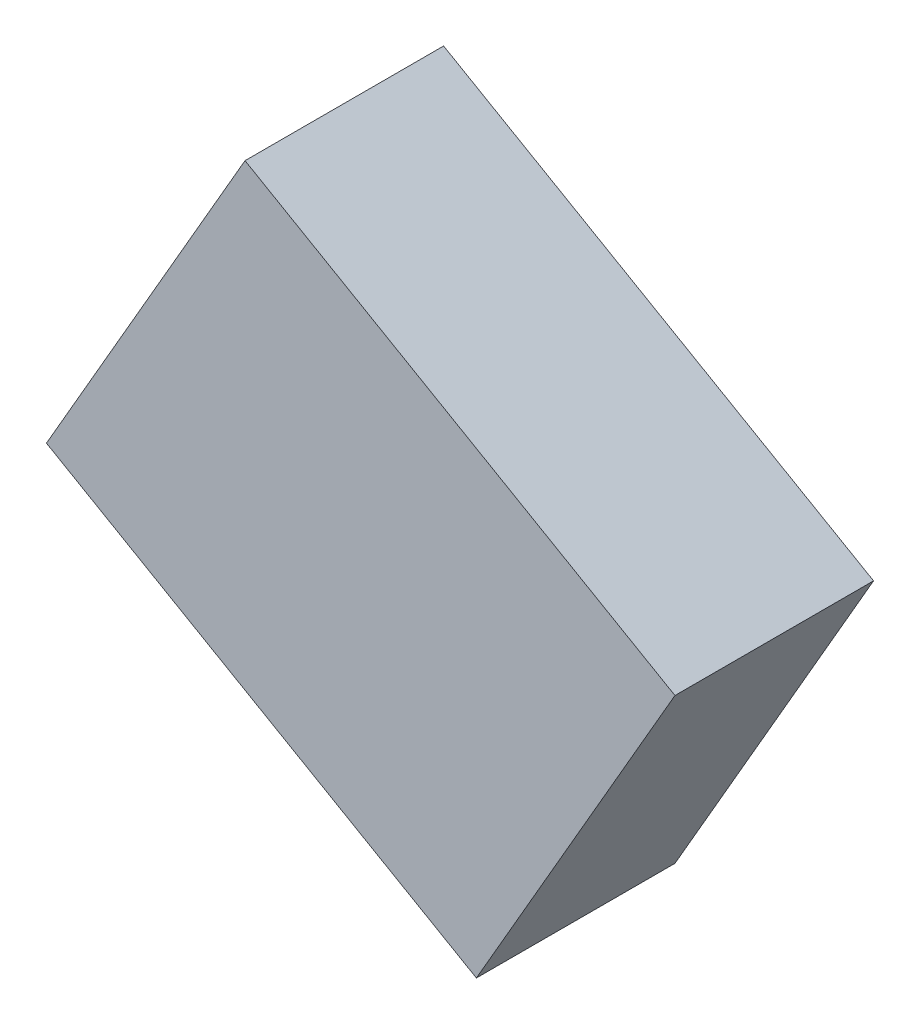
ISO-10303-21;
HEADER;
FILE_DESCRIPTION(('STEP AP214'),'2;1');
FILE_NAME('part.step','',(''),(''),'','','');
FILE_SCHEMA(('AUTOMOTIVE_DESIGN { 1 0 10303 214 1 1 1 1 }'));
ENDSEC;
DATA;
#1=APPLICATION_CONTEXT('core data for automotive mechanical design processes');
#2=APPLICATION_PROTOCOL_DEFINITION('international standard','automotive_design',2000,#1);
#3=PRODUCT_CONTEXT('',#1,'mechanical');
#4=PRODUCT('Part','Part','',(#3));
#5=PRODUCT_RELATED_PRODUCT_CATEGORY('part','',(#4));
#6=PRODUCT_DEFINITION_FORMATION('','',#4);
#7=PRODUCT_DEFINITION_CONTEXT('part definition',#1,'design');
#8=PRODUCT_DEFINITION('design','',#6,#7);
#9=PRODUCT_DEFINITION_SHAPE('','',#8);
#10=(LENGTH_UNIT() NAMED_UNIT(*) SI_UNIT(.MILLI.,.METRE.));
#11=(NAMED_UNIT(*) PLANE_ANGLE_UNIT() SI_UNIT($,.RADIAN.));
#12=(NAMED_UNIT(*) SI_UNIT($,.STERADIAN.) SOLID_ANGLE_UNIT());
#13=UNCERTAINTY_MEASURE_WITH_UNIT(LENGTH_MEASURE(1.E-05),#10,'distance_accuracy_value','');
#14=(GEOMETRIC_REPRESENTATION_CONTEXT(3) GLOBAL_UNCERTAINTY_ASSIGNED_CONTEXT((#13)) GLOBAL_UNIT_ASSIGNED_CONTEXT((#10,
#11,#12)) REPRESENTATION_CONTEXT('',''));
#15=CARTESIAN_POINT('',(0.,0.,0.));
#16=DIRECTION('',(0.,0.,1.));
#17=DIRECTION('',(1.,0.,0.));
#18=AXIS2_PLACEMENT_3D('',#15,#16,#17);
#19=CARTESIAN_POINT('',(-1.58253176,-0.24102568,1.00000054));
#20=DIRECTION('',(0.,0.,1.));
#21=DIRECTION('',(1.,0.,0.));
#22=AXIS2_PLACEMENT_3D('',#19,#20,#21);
#23=PLANE('',#22);
#24=DIRECTION('',(-0.866025343910241,0.500000103705139,0.));
#25=VECTOR('',#24,1.);
#26=CARTESIAN_POINT('',(-0.58253122,1.49102572,1.00000054));
#27=LINE('',#26,#25);
#28=CARTESIAN_POINT('',(-0.582531219999969,1.49102571999998,1.00000054));
#29=VERTEX_POINT('',#28);
#30=CARTESIAN_POINT('',(1.58253176000008,0.241025680000142,1.00000054));
#31=VERTEX_POINT('',#30);
#32=EDGE_CURVE('E53',#29,#31,#27,.F.);
#33=ORIENTED_EDGE('',*,*,#32,.F.);
#34=DIRECTION('',(-0.50000007423493,-0.866025360924878,0.));
#35=VECTOR('',#34,1.);
#36=CARTESIAN_POINT('',(-1.58253176,-0.24102568,1.00000054));
#37=LINE('',#36,#35);
#38=CARTESIAN_POINT('',(-1.58253176000016,-0.241025680000285,1.00000054));
#39=VERTEX_POINT('',#38);
#40=EDGE_CURVE('E68',#39,#29,#37,.F.);
#41=ORIENTED_EDGE('',*,*,#40,.F.);
#42=DIRECTION('',(0.866025343910241,-0.500000103705139,0.));
#43=VECTOR('',#42,1.);
#44=CARTESIAN_POINT('',(0.58253122,-1.49102572,1.00000054));
#45=LINE('',#44,#43);
#46=CARTESIAN_POINT('',(0.582531219999969,-1.49102571999998,1.00000054));
#47=VERTEX_POINT('',#46);
#48=EDGE_CURVE('E20',#47,#39,#45,.F.);
#49=ORIENTED_EDGE('',*,*,#48,.F.);
#50=DIRECTION('',(0.50000007423493,0.866025360924878,0.));
#51=VECTOR('',#50,1.);
#52=CARTESIAN_POINT('',(1.58253176,0.24102568,1.00000054));
#53=LINE('',#52,#51);
#54=EDGE_CURVE('E58',#31,#47,#53,.F.);
#55=ORIENTED_EDGE('',*,*,#54,.F.);
#56=EDGE_LOOP('',(#33,#41,#49,#55));
#57=FACE_BOUND('',#56,.T.);
#58=ADVANCED_FACE('F17',(#57),#23,.T.);
#59=CARTESIAN_POINT('',(0.58253122,-1.49102572,0.));
#60=DIRECTION('',(-0.500000103705139,-0.866025343910241,0.));
#61=DIRECTION('',(0.866025343910241,-0.500000103705139,0.));
#62=AXIS2_PLACEMENT_3D('',#59,#60,#61);
#63=PLANE('',#62);
#64=DIRECTION('',(0.,0.,1.));
#65=VECTOR('',#64,1.);
#66=CARTESIAN_POINT('',(-1.58253176,-0.24102568,0.));
#67=LINE('',#66,#65);
#68=CARTESIAN_POINT('',(-1.58253176000016,-0.241025680000285,0.));
#69=VERTEX_POINT('',#68);
#70=EDGE_CURVE('E79',#69,#39,#67,.T.);
#71=ORIENTED_EDGE('',*,*,#70,.F.);
#72=DIRECTION('',(0.866025343910109,-0.500000103705367,0.));
#73=VECTOR('',#72,1.);
#74=CARTESIAN_POINT('',(-1.58253176,-0.24102568,0.));
#75=LINE('',#74,#73);
#76=CARTESIAN_POINT('',(0.582531219999969,-1.49102571999998,0.));
#77=VERTEX_POINT('',#76);
#78=EDGE_CURVE('E74',#69,#77,#75,.T.);
#79=ORIENTED_EDGE('',*,*,#78,.T.);
#80=DIRECTION('',(0.,0.,1.));
#81=VECTOR('',#80,1.);
#82=CARTESIAN_POINT('',(0.582531219999878,-1.49102571999993,0.));
#83=LINE('',#82,#81);
#84=EDGE_CURVE('E63',#47,#77,#83,.F.);
#85=ORIENTED_EDGE('',*,*,#84,.F.);
#86=ORIENTED_EDGE('',*,*,#48,.T.);
#87=EDGE_LOOP('',(#71,#79,#85,#86));
#88=FACE_BOUND('',#87,.T.);
#89=ADVANCED_FACE('F73',(#88),#63,.T.);
#90=CARTESIAN_POINT('',(1.58253176,0.24102568,0.));
#91=DIRECTION('',(0.866025360924878,-0.50000007423493,0.));
#92=DIRECTION('',(0.50000007423493,0.866025360924878,0.));
#93=AXIS2_PLACEMENT_3D('',#90,#91,#92);
#94=PLANE('',#93);
#95=ORIENTED_EDGE('',*,*,#84,.T.);
#96=DIRECTION('',(0.500000074234869,0.866025360924913,0.));
#97=VECTOR('',#96,1.);
#98=CARTESIAN_POINT('',(0.58253122,-1.49102572,0.));
#99=LINE('',#98,#97);
#100=CARTESIAN_POINT('',(1.58253176000008,0.241025680000142,0.));
#101=VERTEX_POINT('',#100);
#102=EDGE_CURVE('E84',#77,#101,#99,.T.);
#103=ORIENTED_EDGE('',*,*,#102,.T.);
#104=DIRECTION('',(0.,0.,1.));
#105=VECTOR('',#104,1.);
#106=CARTESIAN_POINT('',(1.58253176000033,0.241025680000569,0.));
#107=LINE('',#106,#105);
#108=EDGE_CURVE('E65',#31,#101,#107,.F.);
#109=ORIENTED_EDGE('',*,*,#108,.F.);
#110=ORIENTED_EDGE('',*,*,#54,.T.);
#111=EDGE_LOOP('',(#95,#103,#109,#110));
#112=FACE_BOUND('',#111,.T.);
#113=ADVANCED_FACE('F60',(#112),#94,.T.);
#114=CARTESIAN_POINT('',(-0.58253122,1.49102572,0.));
#115=DIRECTION('',(0.500000103705139,0.866025343910241,0.));
#116=DIRECTION('',(-0.866025343910241,0.500000103705139,0.));
#117=AXIS2_PLACEMENT_3D('',#114,#115,#116);
#118=PLANE('',#117);
#119=ORIENTED_EDGE('',*,*,#108,.T.);
#120=DIRECTION('',(-0.866025343910109,0.500000103705367,0.));
#121=VECTOR('',#120,1.);
#122=CARTESIAN_POINT('',(1.58253176,0.24102568,0.));
#123=LINE('',#122,#121);
#124=CARTESIAN_POINT('',(-0.582531219999969,1.49102571999998,0.));
#125=VERTEX_POINT('',#124);
#126=EDGE_CURVE('E26',#101,#125,#123,.T.);
#127=ORIENTED_EDGE('',*,*,#126,.T.);
#128=DIRECTION('',(0.,0.,1.));
#129=VECTOR('',#128,1.);
#130=CARTESIAN_POINT('',(-0.582531219999878,1.49102571999993,0.));
#131=LINE('',#130,#129);
#132=EDGE_CURVE('E34',#29,#125,#131,.F.);
#133=ORIENTED_EDGE('',*,*,#132,.F.);
#134=ORIENTED_EDGE('',*,*,#32,.T.);
#135=EDGE_LOOP('',(#119,#127,#133,#134));
#136=FACE_BOUND('',#135,.T.);
#137=ADVANCED_FACE('F88',(#136),#118,.T.);
#138=CARTESIAN_POINT('',(-1.58253176,-0.24102568,0.));
#139=DIRECTION('',(-0.866025360924878,0.50000007423493,0.));
#140=DIRECTION('',(-0.50000007423493,-0.866025360924878,0.));
#141=AXIS2_PLACEMENT_3D('',#138,#139,#140);
#142=PLANE('',#141);
#143=ORIENTED_EDGE('',*,*,#132,.T.);
#144=DIRECTION('',(-0.500000074234869,-0.866025360924913,0.));
#145=VECTOR('',#144,1.);
#146=CARTESIAN_POINT('',(-0.58253122,1.49102572,0.));
#147=LINE('',#146,#145);
#148=EDGE_CURVE('E11',#125,#69,#147,.T.);
#149=ORIENTED_EDGE('',*,*,#148,.T.);
#150=ORIENTED_EDGE('',*,*,#70,.T.);
#151=ORIENTED_EDGE('',*,*,#40,.T.);
#152=EDGE_LOOP('',(#143,#149,#150,#151));
#153=FACE_BOUND('',#152,.T.);
#154=ADVANCED_FACE('F91',(#153),#142,.T.);
#155=CARTESIAN_POINT('',(-1.58253176,-0.24102568,0.));
#156=DIRECTION('',(0.,0.,1.));
#157=DIRECTION('',(1.,0.,0.));
#158=AXIS2_PLACEMENT_3D('',#155,#156,#157);
#159=PLANE('',#158);
#160=ORIENTED_EDGE('',*,*,#126,.F.);
#161=ORIENTED_EDGE('',*,*,#102,.F.);
#162=ORIENTED_EDGE('',*,*,#78,.F.);
#163=ORIENTED_EDGE('',*,*,#148,.F.);
#164=EDGE_LOOP('',(#160,#161,#162,#163));
#165=FACE_BOUND('',#164,.T.);
#166=ADVANCED_FACE('F90',(#165),#159,.F.);
#167=CLOSED_SHELL('',(#58,#89,#113,#137,#154,#166));
#168=MANIFOLD_SOLID_BREP('B1',#167);
#169=ADVANCED_BREP_SHAPE_REPRESENTATION('',(#18,#168),#14);
#170=SHAPE_DEFINITION_REPRESENTATION(#9,#169);
ENDSEC;
END-ISO-10303-21;
